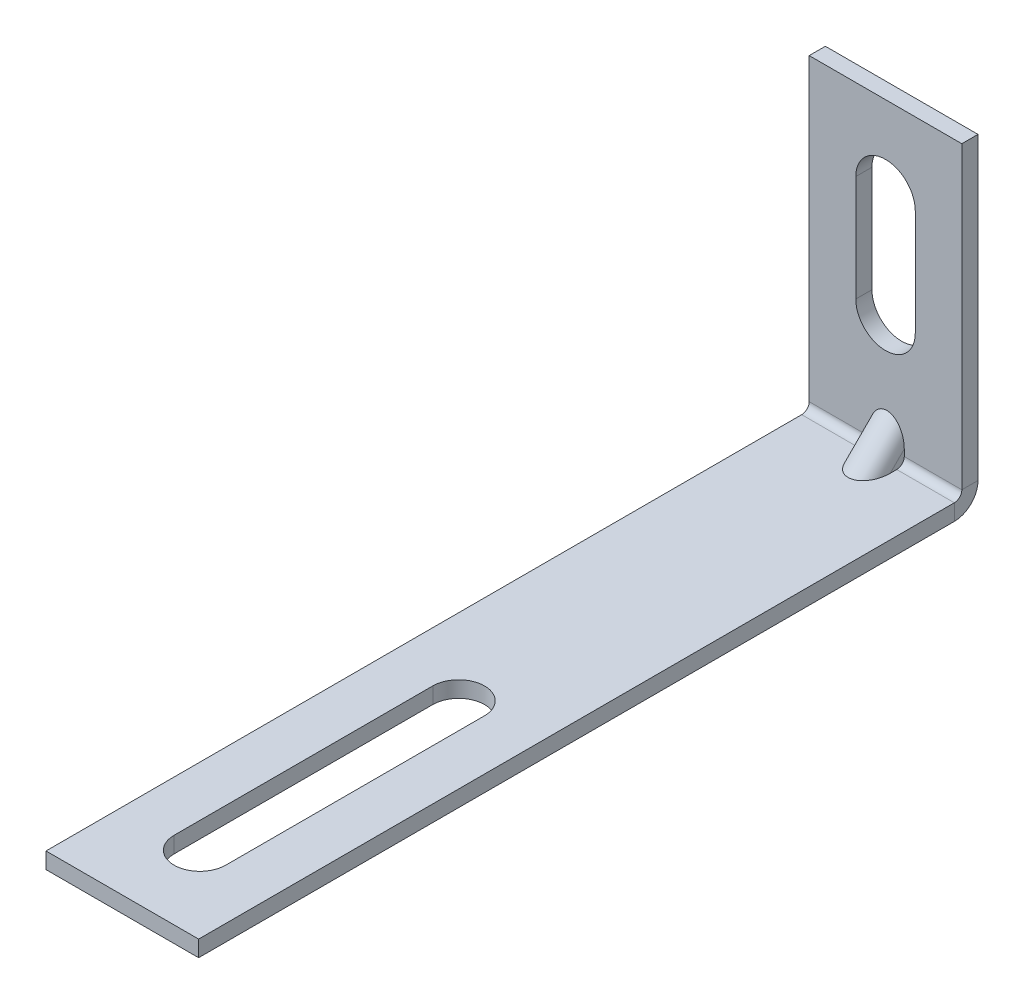
ISO-10303-21;
HEADER;
FILE_DESCRIPTION(('STEP AP214'),'2;1');
FILE_NAME('part.step','',(''),(''),'','','');
FILE_SCHEMA(('AUTOMOTIVE_DESIGN { 1 0 10303 214 1 1 1 1 }'));
ENDSEC;
DATA;
#1=APPLICATION_CONTEXT('core data for automotive mechanical design processes');
#2=APPLICATION_PROTOCOL_DEFINITION('international standard','automotive_design',2000,#1);
#3=PRODUCT_CONTEXT('',#1,'mechanical');
#4=PRODUCT('Part','Part','',(#3));
#5=PRODUCT_RELATED_PRODUCT_CATEGORY('part','',(#4));
#6=PRODUCT_DEFINITION_FORMATION('','',#4);
#7=PRODUCT_DEFINITION_CONTEXT('part definition',#1,'design');
#8=PRODUCT_DEFINITION('design','',#6,#7);
#9=PRODUCT_DEFINITION_SHAPE('','',#8);
#10=(LENGTH_UNIT() NAMED_UNIT(*) SI_UNIT(.MILLI.,.METRE.));
#11=(NAMED_UNIT(*) PLANE_ANGLE_UNIT() SI_UNIT($,.RADIAN.));
#12=(NAMED_UNIT(*) SI_UNIT($,.STERADIAN.) SOLID_ANGLE_UNIT());
#13=UNCERTAINTY_MEASURE_WITH_UNIT(LENGTH_MEASURE(1.E-05),#10,'distance_accuracy_value','');
#14=(GEOMETRIC_REPRESENTATION_CONTEXT(3) GLOBAL_UNCERTAINTY_ASSIGNED_CONTEXT((#13)) GLOBAL_UNIT_ASSIGNED_CONTEXT((#10,
#11,#12)) REPRESENTATION_CONTEXT('',''));
#15=CARTESIAN_POINT('',(0.,0.,0.));
#16=DIRECTION('',(0.,0.,1.));
#17=DIRECTION('',(1.,0.,0.));
#18=AXIS2_PLACEMENT_3D('',#15,#16,#17);
#19=CARTESIAN_POINT('',(-7.493,2.32409999999999,2.3241));
#20=DIRECTION('',(-1.,0.,0.));
#21=DIRECTION('',(0.,0.,-1.));
#22=AXIS2_PLACEMENT_3D('',#19,#20,#21);
#23=CYLINDRICAL_SURFACE('',#22,2.3241);
#24=DIRECTION('',(-1.,0.,0.));
#25=VECTOR('',#24,1.);
#26=CARTESIAN_POINT('',(-7.493,0.,2.3241));
#27=LINE('',#26,#25);
#28=CARTESIAN_POINT('',(0.253999999999999,0.,2.3241));
#29=VERTEX_POINT('',#28);
#30=CARTESIAN_POINT('',(7.493,0.,2.3241));
#31=VERTEX_POINT('',#30);
#32=EDGE_CURVE('E355',#29,#31,#27,.F.);
#33=ORIENTED_EDGE('',*,*,#32,.F.);
#34=CARTESIAN_POINT('',(0.253999999999999,2.32409999999999,2.3241));
#35=DIRECTION('',(-1.,0.,0.));
#36=DIRECTION('',(0.,0.,1.));
#37=AXIS2_PLACEMENT_3D('',#34,#35,#36);
#38=CIRCLE('',#37,2.3241);
#39=CARTESIAN_POINT('',(0.253999999999999,2.32409999999998,0.));
#40=VERTEX_POINT('',#39);
#41=EDGE_CURVE('E256',#29,#40,#38,.F.);
#42=ORIENTED_EDGE('',*,*,#41,.T.);
#43=DIRECTION('',(-1.,0.,0.));
#44=VECTOR('',#43,1.);
#45=CARTESIAN_POINT('',(7.493,2.32410000000001,0.));
#46=LINE('',#45,#44);
#47=CARTESIAN_POINT('',(7.493,2.32409999999998,0.));
#48=VERTEX_POINT('',#47);
#49=EDGE_CURVE('E342',#40,#48,#46,.F.);
#50=ORIENTED_EDGE('',*,*,#49,.T.);
#51=CARTESIAN_POINT('',(7.493,2.32409999999999,2.3241));
#52=DIRECTION('',(-1.,0.,0.));
#53=DIRECTION('',(0.,0.,1.));
#54=AXIS2_PLACEMENT_3D('',#51,#52,#53);
#55=CIRCLE('',#54,2.3241);
#56=EDGE_CURVE('E354',#31,#48,#55,.F.);
#57=ORIENTED_EDGE('',*,*,#56,.F.);
#58=EDGE_LOOP('',(#33,#42,#50,#57));
#59=FACE_BOUND('',#58,.T.);
#60=ADVANCED_FACE('F61',(#59),#23,.T.);
#61=CARTESIAN_POINT('',(-7.493,2.32409999999999,2.3241));
#62=DIRECTION('',(-1.,0.,0.));
#63=DIRECTION('',(0.,0.,-1.));
#64=AXIS2_PLACEMENT_3D('',#61,#62,#63);
#65=CYLINDRICAL_SURFACE('',#64,0.736600000000001);
#66=CARTESIAN_POINT('',(1.8415,2.32409999999999,2.3241));
#67=DIRECTION('',(-1.,0.,0.));
#68=DIRECTION('',(0.,0.,1.));
#69=AXIS2_PLACEMENT_3D('',#66,#67,#68);
#70=CIRCLE('',#69,0.736600000000001);
#71=CARTESIAN_POINT('',(1.8415,1.58749999999999,2.3241));
#72=VERTEX_POINT('',#71);
#73=CARTESIAN_POINT('',(1.8415,2.3241,1.58749999999999));
#74=VERTEX_POINT('',#73);
#75=EDGE_CURVE('E275',#72,#74,#70,.F.);
#76=ORIENTED_EDGE('',*,*,#75,.F.);
#77=DIRECTION('',(-1.,0.,0.));
#78=VECTOR('',#77,1.);
#79=CARTESIAN_POINT('',(-7.493,1.58749999999999,2.3241));
#80=LINE('',#79,#78);
#81=CARTESIAN_POINT('',(7.493,1.5875,2.3241));
#82=VERTEX_POINT('',#81);
#83=EDGE_CURVE('E368',#72,#82,#80,.F.);
#84=ORIENTED_EDGE('',*,*,#83,.T.);
#85=CARTESIAN_POINT('',(7.493,2.32409999999999,2.3241));
#86=DIRECTION('',(-1.,0.,0.));
#87=DIRECTION('',(0.,0.,1.));
#88=AXIS2_PLACEMENT_3D('',#85,#86,#87);
#89=CIRCLE('',#88,0.736600000000001);
#90=CARTESIAN_POINT('',(7.493,2.32409999999999,1.58749999999999));
#91=VERTEX_POINT('',#90);
#92=EDGE_CURVE('E362',#82,#91,#89,.F.);
#93=ORIENTED_EDGE('',*,*,#92,.T.);
#94=DIRECTION('',(-1.,0.,0.));
#95=VECTOR('',#94,1.);
#96=CARTESIAN_POINT('',(7.493,2.3241,1.5875));
#97=LINE('',#96,#95);
#98=EDGE_CURVE('E346',#91,#74,#97,.T.);
#99=ORIENTED_EDGE('',*,*,#98,.T.);
#100=EDGE_LOOP('',(#76,#84,#93,#99));
#101=FACE_BOUND('',#100,.T.);
#102=ADVANCED_FACE('F436',(#101),#65,.F.);
#103=CARTESIAN_POINT('',(7.493,1.5875,0.));
#104=DIRECTION('',(-1.,0.,0.));
#105=DIRECTION('',(0.,0.,1.));
#106=AXIS2_PLACEMENT_3D('',#103,#104,#105);
#107=PLANE('',#106);
#108=DIRECTION('',(0.,-1.,0.));
#109=VECTOR('',#108,1.);
#110=CARTESIAN_POINT('',(7.493,1.58749999999999,2.3241));
#111=LINE('',#110,#109);
#112=EDGE_CURVE('E371',#82,#31,#111,.T.);
#113=ORIENTED_EDGE('',*,*,#112,.F.);
#114=DIRECTION('',(0.,0.,-1.));
#115=VECTOR('',#114,1.);
#116=CARTESIAN_POINT('',(7.493,1.5875,0.));
#117=LINE('',#116,#115);
#118=CARTESIAN_POINT('',(7.49300000000001,1.5875,76.5175));
#119=VERTEX_POINT('',#118);
#120=EDGE_CURVE('E376',#119,#82,#117,.T.);
#121=ORIENTED_EDGE('',*,*,#120,.F.);
#122=DIRECTION('',(0.,-1.,0.));
#123=VECTOR('',#122,1.);
#124=CARTESIAN_POINT('',(7.49300000000001,1.5875,76.5175));
#125=LINE('',#124,#123);
#126=CARTESIAN_POINT('',(7.49300000000001,0.,76.5175));
#127=VERTEX_POINT('',#126);
#128=EDGE_CURVE('E384',#119,#127,#125,.T.);
#129=ORIENTED_EDGE('',*,*,#128,.T.);
#130=DIRECTION('',(0.,0.,-1.));
#131=VECTOR('',#130,1.);
#132=CARTESIAN_POINT('',(7.493,0.,0.));
#133=LINE('',#132,#131);
#134=EDGE_CURVE('E374',#127,#31,#133,.T.);
#135=ORIENTED_EDGE('',*,*,#134,.T.);
#136=EDGE_LOOP('',(#113,#121,#129,#135));
#137=FACE_BOUND('',#136,.T.);
#138=ADVANCED_FACE('F63',(#137),#107,.F.);
#139=CARTESIAN_POINT('',(-7.493,1.5875,0.));
#140=DIRECTION('',(1.,0.,0.));
#141=DIRECTION('',(0.,0.,-1.));
#142=AXIS2_PLACEMENT_3D('',#139,#140,#141);
#143=PLANE('',#142);
#144=DIRECTION('',(0.,-1.,0.));
#145=VECTOR('',#144,1.);
#146=CARTESIAN_POINT('',(-7.493,1.58749999999999,2.3241));
#147=LINE('',#146,#145);
#148=CARTESIAN_POINT('',(-7.493,1.5875,2.3241));
#149=VERTEX_POINT('',#148);
#150=CARTESIAN_POINT('',(-7.493,0.,2.3241));
#151=VERTEX_POINT('',#150);
#152=EDGE_CURVE('E358',#149,#151,#147,.T.);
#153=ORIENTED_EDGE('',*,*,#152,.T.);
#154=DIRECTION('',(0.,0.,1.));
#155=VECTOR('',#154,1.);
#156=CARTESIAN_POINT('',(-7.493,0.,0.));
#157=LINE('',#156,#155);
#158=CARTESIAN_POINT('',(-7.49300000000001,0.,76.5175));
#159=VERTEX_POINT('',#158);
#160=EDGE_CURVE('E387',#151,#159,#157,.T.);
#161=ORIENTED_EDGE('',*,*,#160,.T.);
#162=DIRECTION('',(0.,-1.,0.));
#163=VECTOR('',#162,1.);
#164=CARTESIAN_POINT('',(-7.49300000000001,1.5875,76.5175));
#165=LINE('',#164,#163);
#166=CARTESIAN_POINT('',(-7.49300000000001,1.5875,76.5175));
#167=VERTEX_POINT('',#166);
#168=EDGE_CURVE('E392',#167,#159,#165,.T.);
#169=ORIENTED_EDGE('',*,*,#168,.F.);
#170=DIRECTION('',(0.,0.,1.));
#171=VECTOR('',#170,1.);
#172=CARTESIAN_POINT('',(-7.493,1.5875,0.));
#173=LINE('',#172,#171);
#174=EDGE_CURVE('E379',#149,#167,#173,.T.);
#175=ORIENTED_EDGE('',*,*,#174,.F.);
#176=EDGE_LOOP('',(#153,#161,#169,#175));
#177=FACE_BOUND('',#176,.T.);
#178=ADVANCED_FACE('F469',(#177),#143,.F.);
#179=CARTESIAN_POINT('',(0.,1.5875,0.));
#180=DIRECTION('',(0.,1.,0.));
#181=DIRECTION('',(0.,0.,1.));
#182=AXIS2_PLACEMENT_3D('',#179,#180,#181);
#183=PLANE('',#182);
#184=CARTESIAN_POINT('',(0.,1.5875,68.8975));
#185=DIRECTION('',(0.,1.,0.));
#186=DIRECTION('',(0.,0.,1.));
#187=AXIS2_PLACEMENT_3D('',#184,#185,#186);
#188=CIRCLE('',#187,2.54);
#189=CARTESIAN_POINT('',(-2.54000000000001,1.5875,68.8975));
#190=VERTEX_POINT('',#189);
#191=CARTESIAN_POINT('',(2.53999999999999,1.5875,68.8975));
#192=VERTEX_POINT('',#191);
#193=EDGE_CURVE('E76',#190,#192,#188,.T.);
#194=ORIENTED_EDGE('',*,*,#193,.F.);
#195=DIRECTION('',(0.,0.,1.));
#196=VECTOR('',#195,1.);
#197=CARTESIAN_POINT('',(-2.54000000000001,1.5875,68.8975));
#198=LINE('',#197,#196);
#199=CARTESIAN_POINT('',(-2.54,1.5875,43.4975));
#200=VERTEX_POINT('',#199);
#201=EDGE_CURVE('E241',#200,#190,#198,.T.);
#202=ORIENTED_EDGE('',*,*,#201,.F.);
#203=CARTESIAN_POINT('',(0.,1.5875,43.4975));
#204=DIRECTION('',(0.,1.,0.));
#205=DIRECTION('',(0.,0.,1.));
#206=AXIS2_PLACEMENT_3D('',#203,#204,#205);
#207=CIRCLE('',#206,2.54);
#208=CARTESIAN_POINT('',(2.54,1.5875,43.4975));
#209=VERTEX_POINT('',#208);
#210=EDGE_CURVE('E225',#209,#200,#207,.T.);
#211=ORIENTED_EDGE('',*,*,#210,.F.);
#212=DIRECTION('',(0.,0.,-1.));
#213=VECTOR('',#212,1.);
#214=CARTESIAN_POINT('',(2.53999999999999,1.5875,68.8975));
#215=LINE('',#214,#213);
#216=EDGE_CURVE('E234',#192,#209,#215,.T.);
#217=ORIENTED_EDGE('',*,*,#216,.F.);
#218=EDGE_LOOP('',(#194,#202,#211,#217));
#219=FACE_BOUND('',#218,.T.);
#220=DIRECTION('',(0.,0.,1.));
#221=VECTOR('',#220,1.);
#222=CARTESIAN_POINT('',(-1.5875,1.5875,0.));
#223=LINE('',#222,#221);
#224=CARTESIAN_POINT('',(-1.5875,1.58749999999999,2.3241));
#225=VERTEX_POINT('',#224);
#226=CARTESIAN_POINT('',(-1.5875,1.5875,2.96191718266822));
#227=VERTEX_POINT('',#226);
#228=EDGE_CURVE('E285',#225,#227,#223,.T.);
#229=ORIENTED_EDGE('',*,*,#228,.F.);
#230=EDGE_CURVE('E365',#149,#225,#80,.F.);
#231=ORIENTED_EDGE('',*,*,#230,.F.);
#232=ORIENTED_EDGE('',*,*,#174,.T.);
#233=DIRECTION('',(1.,0.,0.));
#234=VECTOR('',#233,1.);
#235=CARTESIAN_POINT('',(-7.49300000000001,1.5875,76.5175));
#236=LINE('',#235,#234);
#237=EDGE_CURVE('E382',#167,#119,#236,.T.);
#238=ORIENTED_EDGE('',*,*,#237,.T.);
#239=ORIENTED_EDGE('',*,*,#120,.T.);
#240=ORIENTED_EDGE('',*,*,#83,.F.);
#241=DIRECTION('',(0.,0.,1.));
#242=VECTOR('',#241,1.);
#243=CARTESIAN_POINT('',(1.8415,1.5875,0.));
#244=LINE('',#243,#242);
#245=CARTESIAN_POINT('',(1.8415,1.5875,2.96191718266822));
#246=VERTEX_POINT('',#245);
#247=EDGE_CURVE('E278',#72,#246,#244,.T.);
#248=ORIENTED_EDGE('',*,*,#247,.T.);
#249=CARTESIAN_POINT('',(0.126999999999999,1.5875,2.96191718266822));
#250=DIRECTION('',(0.,1.,0.));
#251=DIRECTION('',(0.,0.,1.));
#252=AXIS2_PLACEMENT_3D('',#249,#250,#251);
#253=ELLIPSE('',#252,2.42466915268866,1.7145);
#254=EDGE_CURVE('E291',#227,#246,#253,.T.);
#255=ORIENTED_EDGE('',*,*,#254,.F.);
#256=EDGE_LOOP('',(#229,#231,#232,#238,#239,#240,#248,#255));
#257=FACE_BOUND('',#256,.T.);
#258=ADVANCED_FACE('F238',(#219,#257),#183,.T.);
#259=CARTESIAN_POINT('',(0.,0.,0.));
#260=DIRECTION('',(0.,1.,0.));
#261=DIRECTION('',(0.,0.,1.));
#262=AXIS2_PLACEMENT_3D('',#259,#260,#261);
#263=PLANE('',#262);
#264=DIRECTION('',(0.,0.,1.));
#265=VECTOR('',#264,1.);
#266=CARTESIAN_POINT('',(-2.53999999999999,0.,0.));
#267=LINE('',#266,#265);
#268=CARTESIAN_POINT('',(-2.54,0.,43.4975));
#269=VERTEX_POINT('',#268);
#270=CARTESIAN_POINT('',(-2.54000000000001,0.,68.8975));
#271=VERTEX_POINT('',#270);
#272=EDGE_CURVE('E69',#269,#271,#267,.T.);
#273=ORIENTED_EDGE('',*,*,#272,.T.);
#274=CARTESIAN_POINT('',(0.,0.,68.8975));
#275=DIRECTION('',(0.,1.,0.));
#276=DIRECTION('',(0.,0.,1.));
#277=AXIS2_PLACEMENT_3D('',#274,#275,#276);
#278=CIRCLE('',#277,2.54);
#279=CARTESIAN_POINT('',(2.53999999999999,0.,68.8975));
#280=VERTEX_POINT('',#279);
#281=EDGE_CURVE('E14',#271,#280,#278,.T.);
#282=ORIENTED_EDGE('',*,*,#281,.T.);
#283=DIRECTION('',(0.,0.,-1.));
#284=VECTOR('',#283,1.);
#285=CARTESIAN_POINT('',(2.54000000000002,0.,0.));
#286=LINE('',#285,#284);
#287=CARTESIAN_POINT('',(2.54,0.,43.4975));
#288=VERTEX_POINT('',#287);
#289=EDGE_CURVE('E412',#280,#288,#286,.T.);
#290=ORIENTED_EDGE('',*,*,#289,.T.);
#291=CARTESIAN_POINT('',(0.,0.,43.4975));
#292=DIRECTION('',(0.,1.,0.));
#293=DIRECTION('',(0.,0.,1.));
#294=AXIS2_PLACEMENT_3D('',#291,#292,#293);
#295=CIRCLE('',#294,2.54);
#296=EDGE_CURVE('E228',#288,#269,#295,.T.);
#297=ORIENTED_EDGE('',*,*,#296,.T.);
#298=EDGE_LOOP('',(#273,#282,#290,#297));
#299=FACE_BOUND('',#298,.T.);
#300=CARTESIAN_POINT('',(0.,0.,2.3241));
#301=VERTEX_POINT('',#300);
#302=EDGE_CURVE('E351',#151,#301,#27,.F.);
#303=ORIENTED_EDGE('',*,*,#302,.T.);
#304=DIRECTION('',(0.,0.,1.));
#305=VECTOR('',#304,1.);
#306=CARTESIAN_POINT('',(0.,0.,0.));
#307=LINE('',#306,#305);
#308=CARTESIAN_POINT('',(0.,0.,4.54941718266821));
#309=VERTEX_POINT('',#308);
#310=EDGE_CURVE('E263',#301,#309,#307,.T.);
#311=ORIENTED_EDGE('',*,*,#310,.T.);
#312=CARTESIAN_POINT('',(0.126999999999999,0.,4.54941718266821));
#313=DIRECTION('',(0.,1.,0.));
#314=DIRECTION('',(0.,0.,1.));
#315=AXIS2_PLACEMENT_3D('',#312,#313,#314);
#316=ELLIPSE('',#315,0.179605122421383,0.127);
#317=CARTESIAN_POINT('',(0.253999999999999,0.,4.54941718266821));
#318=VERTEX_POINT('',#317);
#319=EDGE_CURVE('E266',#309,#318,#316,.T.);
#320=ORIENTED_EDGE('',*,*,#319,.T.);
#321=DIRECTION('',(0.,0.,1.));
#322=VECTOR('',#321,1.);
#323=CARTESIAN_POINT('',(0.253999999999999,0.,0.));
#324=LINE('',#323,#322);
#325=EDGE_CURVE('E259',#29,#318,#324,.T.);
#326=ORIENTED_EDGE('',*,*,#325,.F.);
#327=ORIENTED_EDGE('',*,*,#32,.T.);
#328=ORIENTED_EDGE('',*,*,#134,.F.);
#329=DIRECTION('',(1.,0.,0.));
#330=VECTOR('',#329,1.);
#331=CARTESIAN_POINT('',(-7.49300000000001,0.,76.5175));
#332=LINE('',#331,#330);
#333=EDGE_CURVE('E380',#159,#127,#332,.T.);
#334=ORIENTED_EDGE('',*,*,#333,.F.);
#335=ORIENTED_EDGE('',*,*,#160,.F.);
#336=EDGE_LOOP('',(#303,#311,#320,#326,#327,#328,#334,#335));
#337=FACE_BOUND('',#336,.T.);
#338=ADVANCED_FACE('F416',(#299,#337),#263,.F.);
#339=CARTESIAN_POINT('',(-7.49300000000001,1.5875,76.5175));
#340=DIRECTION('',(0.,0.,-1.));
#341=DIRECTION('',(-1.,0.,0.));
#342=AXIS2_PLACEMENT_3D('',#339,#340,#341);
#343=PLANE('',#342);
#344=ORIENTED_EDGE('',*,*,#333,.T.);
#345=ORIENTED_EDGE('',*,*,#128,.F.);
#346=ORIENTED_EDGE('',*,*,#237,.F.);
#347=ORIENTED_EDGE('',*,*,#168,.T.);
#348=EDGE_LOOP('',(#344,#345,#346,#347));
#349=FACE_BOUND('',#348,.T.);
#350=ADVANCED_FACE('F474',(#349),#343,.F.);
#351=CARTESIAN_POINT('',(7.493,2.32409999999999,2.3241));
#352=DIRECTION('',(1.,0.,0.));
#353=DIRECTION('',(0.,0.,-1.));
#354=AXIS2_PLACEMENT_3D('',#351,#352,#353);
#355=PLANE('',#354);
#356=DIRECTION('',(0.,0.,1.));
#357=VECTOR('',#356,1.);
#358=CARTESIAN_POINT('',(7.493,2.32410000000001,0.));
#359=LINE('',#358,#357);
#360=EDGE_CURVE('E311',#91,#48,#359,.F.);
#361=ORIENTED_EDGE('',*,*,#360,.F.);
#362=ORIENTED_EDGE('',*,*,#92,.F.);
#363=ORIENTED_EDGE('',*,*,#112,.T.);
#364=ORIENTED_EDGE('',*,*,#56,.T.);
#365=EDGE_LOOP('',(#361,#362,#363,#364));
#366=FACE_BOUND('',#365,.T.);
#367=ADVANCED_FACE('F457',(#366),#355,.T.);
#368=CARTESIAN_POINT('',(-7.493,2.32409999999999,2.3241));
#369=DIRECTION('',(1.,0.,0.));
#370=DIRECTION('',(0.,0.,-1.));
#371=AXIS2_PLACEMENT_3D('',#368,#369,#370);
#372=PLANE('',#371);
#373=CARTESIAN_POINT('',(-7.493,2.32409999999999,2.3241));
#374=DIRECTION('',(-1.,0.,0.));
#375=DIRECTION('',(0.,0.,1.));
#376=AXIS2_PLACEMENT_3D('',#373,#374,#375);
#377=CIRCLE('',#376,0.736600000000001);
#378=CARTESIAN_POINT('',(-7.493,2.32409999999999,1.58749999999999));
#379=VERTEX_POINT('',#378);
#380=EDGE_CURVE('E321',#379,#149,#377,.T.);
#381=ORIENTED_EDGE('',*,*,#380,.F.);
#382=DIRECTION('',(0.,0.,1.));
#383=VECTOR('',#382,1.);
#384=CARTESIAN_POINT('',(-7.493,2.3241,1.5875));
#385=LINE('',#384,#383);
#386=CARTESIAN_POINT('',(-7.493,2.32410000000001,0.));
#387=VERTEX_POINT('',#386);
#388=EDGE_CURVE('E343',#379,#387,#385,.F.);
#389=ORIENTED_EDGE('',*,*,#388,.T.);
#390=CARTESIAN_POINT('',(-7.493,2.32409999999999,2.3241));
#391=DIRECTION('',(-1.,0.,0.));
#392=DIRECTION('',(0.,0.,1.));
#393=AXIS2_PLACEMENT_3D('',#390,#391,#392);
#394=CIRCLE('',#393,2.3241);
#395=EDGE_CURVE('E359',#387,#151,#394,.T.);
#396=ORIENTED_EDGE('',*,*,#395,.T.);
#397=ORIENTED_EDGE('',*,*,#152,.F.);
#398=EDGE_LOOP('',(#381,#389,#396,#397));
#399=FACE_BOUND('',#398,.T.);
#400=ADVANCED_FACE('F449',(#399),#372,.F.);
#401=CARTESIAN_POINT('',(0.,2.32409999999999,2.3241));
#402=DIRECTION('',(-1.,0.,0.));
#403=DIRECTION('',(0.,0.,1.));
#404=AXIS2_PLACEMENT_3D('',#401,#402,#403);
#405=CIRCLE('',#404,2.3241);
#406=CARTESIAN_POINT('',(0.,2.32409999999998,0.));
#407=VERTEX_POINT('',#406);
#408=EDGE_CURVE('E261',#301,#407,#405,.F.);
#409=ORIENTED_EDGE('',*,*,#408,.F.);
#410=ORIENTED_EDGE('',*,*,#302,.F.);
#411=ORIENTED_EDGE('',*,*,#395,.F.);
#412=EDGE_CURVE('E339',#387,#407,#46,.F.);
#413=ORIENTED_EDGE('',*,*,#412,.T.);
#414=EDGE_LOOP('',(#409,#410,#411,#413));
#415=FACE_BOUND('',#414,.T.);
#416=ADVANCED_FACE('F439',(#415),#23,.T.);
#417=ORIENTED_EDGE('',*,*,#230,.T.);
#418=CARTESIAN_POINT('',(-1.5875,2.32409999999999,2.3241));
#419=DIRECTION('',(-1.,0.,0.));
#420=DIRECTION('',(0.,0.,1.));
#421=AXIS2_PLACEMENT_3D('',#418,#419,#420);
#422=CIRCLE('',#421,0.736600000000001);
#423=CARTESIAN_POINT('',(-1.5875,2.3241,1.5875));
#424=VERTEX_POINT('',#423);
#425=EDGE_CURVE('E283',#225,#424,#422,.F.);
#426=ORIENTED_EDGE('',*,*,#425,.T.);
#427=EDGE_CURVE('E348',#424,#379,#97,.T.);
#428=ORIENTED_EDGE('',*,*,#427,.T.);
#429=ORIENTED_EDGE('',*,*,#380,.T.);
#430=EDGE_LOOP('',(#417,#426,#428,#429));
#431=FACE_BOUND('',#430,.T.);
#432=ADVANCED_FACE('F445',(#431),#65,.F.);
#433=CARTESIAN_POINT('',(7.493,1.58749999999999,0.));
#434=DIRECTION('',(-1.,0.,0.));
#435=DIRECTION('',(0.,0.,1.));
#436=AXIS2_PLACEMENT_3D('',#433,#434,#435);
#437=PLANE('',#436);
#438=ORIENTED_EDGE('',*,*,#360,.T.);
#439=DIRECTION('',(0.,-1.,0.));
#440=VECTOR('',#439,1.);
#441=CARTESIAN_POINT('',(7.493,0.,0.));
#442=LINE('',#441,#440);
#443=CARTESIAN_POINT('',(7.493,31.75,-1.07812790568779E-13));
#444=VERTEX_POINT('',#443);
#445=EDGE_CURVE('E329',#444,#48,#442,.T.);
#446=ORIENTED_EDGE('',*,*,#445,.F.);
#447=DIRECTION('',(0.,0.,1.));
#448=VECTOR('',#447,1.);
#449=CARTESIAN_POINT('',(7.493,31.75,-1.07913891096821E-13));
#450=LINE('',#449,#448);
#451=CARTESIAN_POINT('',(7.493,31.75,1.58749999999989));
#452=VERTEX_POINT('',#451);
#453=EDGE_CURVE('E322',#444,#452,#450,.T.);
#454=ORIENTED_EDGE('',*,*,#453,.T.);
#455=DIRECTION('',(0.,1.,0.));
#456=VECTOR('',#455,1.);
#457=CARTESIAN_POINT('',(7.493,1.5875,1.5875));
#458=LINE('',#457,#456);
#459=EDGE_CURVE('E336',#452,#91,#458,.F.);
#460=ORIENTED_EDGE('',*,*,#459,.T.);
#461=EDGE_LOOP('',(#438,#446,#454,#460));
#462=FACE_BOUND('',#461,.T.);
#463=ADVANCED_FACE('F455',(#462),#437,.F.);
#464=CARTESIAN_POINT('',(-7.493,31.75,-1.05384451165591E-13));
#465=DIRECTION('',(1.,0.,0.));
#466=DIRECTION('',(0.,0.,-1.));
#467=AXIS2_PLACEMENT_3D('',#464,#465,#466);
#468=PLANE('',#467);
#469=ORIENTED_EDGE('',*,*,#388,.F.);
#470=DIRECTION('',(0.,-1.,0.));
#471=VECTOR('',#470,1.);
#472=CARTESIAN_POINT('',(-7.493,31.75,1.58749999999989));
#473=LINE('',#472,#471);
#474=CARTESIAN_POINT('',(-7.493,31.75,1.58749999999989));
#475=VERTEX_POINT('',#474);
#476=EDGE_CURVE('E334',#379,#475,#473,.F.);
#477=ORIENTED_EDGE('',*,*,#476,.T.);
#478=DIRECTION('',(0.,0.,1.));
#479=VECTOR('',#478,1.);
#480=CARTESIAN_POINT('',(-7.493,31.75,-1.05396402878654E-13));
#481=LINE('',#480,#479);
#482=CARTESIAN_POINT('',(-7.493,31.75,-1.05222657067876E-13));
#483=VERTEX_POINT('',#482);
#484=EDGE_CURVE('E318',#483,#475,#481,.T.);
#485=ORIENTED_EDGE('',*,*,#484,.F.);
#486=DIRECTION('',(0.,1.,0.));
#487=VECTOR('',#486,1.);
#488=CARTESIAN_POINT('',(-7.493,0.,0.));
#489=LINE('',#488,#487);
#490=EDGE_CURVE('E327',#387,#483,#489,.T.);
#491=ORIENTED_EDGE('',*,*,#490,.F.);
#492=EDGE_LOOP('',(#469,#477,#485,#491));
#493=FACE_BOUND('',#492,.T.);
#494=ADVANCED_FACE('F510',(#493),#468,.F.);
#495=CARTESIAN_POINT('',(0.,0.,0.));
#496=DIRECTION('',(0.,0.,1.));
#497=DIRECTION('',(0.,-1.,0.));
#498=AXIS2_PLACEMENT_3D('',#495,#496,#497);
#499=PLANE('',#498);
#500=CARTESIAN_POINT('',(0.126999999999999,4.54941718266825,0.));
#501=DIRECTION('',(0.,0.,1.));
#502=DIRECTION('',(0.,-1.,0.));
#503=AXIS2_PLACEMENT_3D('',#500,#501,#502);
#504=ELLIPSE('',#503,0.179605122421384,0.127);
#505=CARTESIAN_POINT('',(0.253999999999999,4.54941718266825,0.));
#506=VERTEX_POINT('',#505);
#507=CARTESIAN_POINT('',(0.,4.54941718266825,0.));
#508=VERTEX_POINT('',#507);
#509=EDGE_CURVE('E406',#506,#508,#504,.T.);
#510=ORIENTED_EDGE('',*,*,#509,.T.);
#511=DIRECTION('',(0.,-1.,0.));
#512=VECTOR('',#511,1.);
#513=CARTESIAN_POINT('',(0.,0.,0.));
#514=LINE('',#513,#512);
#515=EDGE_CURVE('E409',#508,#407,#514,.T.);
#516=ORIENTED_EDGE('',*,*,#515,.T.);
#517=ORIENTED_EDGE('',*,*,#412,.F.);
#518=ORIENTED_EDGE('',*,*,#490,.T.);
#519=DIRECTION('',(1.,0.,0.));
#520=VECTOR('',#519,1.);
#521=CARTESIAN_POINT('',(0.,31.75,-1.06517723818327E-13));
#522=LINE('',#521,#520);
#523=EDGE_CURVE('E325',#483,#444,#522,.T.);
#524=ORIENTED_EDGE('',*,*,#523,.T.);
#525=ORIENTED_EDGE('',*,*,#445,.T.);
#526=ORIENTED_EDGE('',*,*,#49,.F.);
#527=DIRECTION('',(0.,-1.,0.));
#528=VECTOR('',#527,1.);
#529=CARTESIAN_POINT('',(0.253999999999999,0.,0.));
#530=LINE('',#529,#528);
#531=EDGE_CURVE('E404',#506,#40,#530,.T.);
#532=ORIENTED_EDGE('',*,*,#531,.F.);
#533=EDGE_LOOP('',(#510,#516,#517,#518,#524,#525,#526,#532));
#534=FACE_BOUND('',#533,.T.);
#535=DIRECTION('',(0.,-1.,0.));
#536=VECTOR('',#535,1.);
#537=CARTESIAN_POINT('',(2.921,23.749,0.));
#538=LINE('',#537,#536);
#539=CARTESIAN_POINT('',(2.921,23.749,0.));
#540=VERTEX_POINT('',#539);
#541=CARTESIAN_POINT('',(2.921,13.335,0.));
#542=VERTEX_POINT('',#541);
#543=EDGE_CURVE('E299',#540,#542,#538,.T.);
#544=ORIENTED_EDGE('',*,*,#543,.F.);
#545=CARTESIAN_POINT('',(0.,23.749,0.));
#546=DIRECTION('',(0.,0.,-1.));
#547=DIRECTION('',(0.,1.,0.));
#548=AXIS2_PLACEMENT_3D('',#545,#546,#547);
#549=CIRCLE('',#548,2.921);
#550=CARTESIAN_POINT('',(-2.921,23.749,0.));
#551=VERTEX_POINT('',#550);
#552=EDGE_CURVE('E297',#551,#540,#549,.T.);
#553=ORIENTED_EDGE('',*,*,#552,.F.);
#554=DIRECTION('',(0.,1.,0.));
#555=VECTOR('',#554,1.);
#556=CARTESIAN_POINT('',(-2.921,23.749,0.));
#557=LINE('',#556,#555);
#558=CARTESIAN_POINT('',(-2.921,13.335,0.));
#559=VERTEX_POINT('',#558);
#560=EDGE_CURVE('E305',#559,#551,#557,.T.);
#561=ORIENTED_EDGE('',*,*,#560,.F.);
#562=CARTESIAN_POINT('',(0.,13.335,0.));
#563=DIRECTION('',(0.,0.,-1.));
#564=DIRECTION('',(0.,1.,0.));
#565=AXIS2_PLACEMENT_3D('',#562,#563,#564);
#566=CIRCLE('',#565,2.921);
#567=EDGE_CURVE('E302',#542,#559,#566,.T.);
#568=ORIENTED_EDGE('',*,*,#567,.F.);
#569=EDGE_LOOP('',(#544,#553,#561,#568));
#570=FACE_BOUND('',#569,.T.);
#571=ADVANCED_FACE('F512',(#534,#570),#499,.F.);
#572=CARTESIAN_POINT('',(0.,0.,1.5875));
#573=DIRECTION('',(0.,0.,1.));
#574=DIRECTION('',(0.,-1.,0.));
#575=AXIS2_PLACEMENT_3D('',#572,#573,#574);
#576=PLANE('',#575);
#577=DIRECTION('',(0.,-1.,0.));
#578=VECTOR('',#577,1.);
#579=CARTESIAN_POINT('',(-1.5875,0.,1.5875));
#580=LINE('',#579,#578);
#581=CARTESIAN_POINT('',(-1.5875,2.96191718266824,1.58749999999999));
#582=VERTEX_POINT('',#581);
#583=EDGE_CURVE('E288',#582,#424,#580,.T.);
#584=ORIENTED_EDGE('',*,*,#583,.F.);
#585=CARTESIAN_POINT('',(0.126999999999999,2.96191718266824,1.58749999999999));
#586=DIRECTION('',(0.,0.,1.));
#587=DIRECTION('',(0.,-1.,0.));
#588=AXIS2_PLACEMENT_3D('',#585,#586,#587);
#589=ELLIPSE('',#588,2.42466915268869,1.7145);
#590=CARTESIAN_POINT('',(1.8415,2.96191718266824,1.58749999999999));
#591=VERTEX_POINT('',#590);
#592=EDGE_CURVE('E294',#591,#582,#589,.T.);
#593=ORIENTED_EDGE('',*,*,#592,.F.);
#594=DIRECTION('',(0.,-1.,0.));
#595=VECTOR('',#594,1.);
#596=CARTESIAN_POINT('',(1.8415,0.,1.5875));
#597=LINE('',#596,#595);
#598=EDGE_CURVE('E280',#591,#74,#597,.T.);
#599=ORIENTED_EDGE('',*,*,#598,.T.);
#600=ORIENTED_EDGE('',*,*,#98,.F.);
#601=ORIENTED_EDGE('',*,*,#459,.F.);
#602=DIRECTION('',(-1.,0.,0.));
#603=VECTOR('',#602,1.);
#604=CARTESIAN_POINT('',(7.493,31.75,1.58749999999989));
#605=LINE('',#604,#603);
#606=EDGE_CURVE('E332',#475,#452,#605,.F.);
#607=ORIENTED_EDGE('',*,*,#606,.F.);
#608=ORIENTED_EDGE('',*,*,#476,.F.);
#609=ORIENTED_EDGE('',*,*,#427,.F.);
#610=EDGE_LOOP('',(#584,#593,#599,#600,#601,#607,#608,#609));
#611=FACE_BOUND('',#610,.T.);
#612=CARTESIAN_POINT('',(0.,23.749,1.58749999999992));
#613=DIRECTION('',(0.,0.,1.));
#614=DIRECTION('',(0.,-1.,0.));
#615=AXIS2_PLACEMENT_3D('',#612,#613,#614);
#616=CIRCLE('',#615,2.921);
#617=CARTESIAN_POINT('',(2.921,23.749,1.58749999999994));
#618=VERTEX_POINT('',#617);
#619=CARTESIAN_POINT('',(-2.921,23.749,1.58749999999994));
#620=VERTEX_POINT('',#619);
#621=EDGE_CURVE('E402',#618,#620,#616,.T.);
#622=ORIENTED_EDGE('',*,*,#621,.F.);
#623=DIRECTION('',(0.,1.,0.));
#624=VECTOR('',#623,1.);
#625=CARTESIAN_POINT('',(2.921,0.,1.5875));
#626=LINE('',#625,#624);
#627=CARTESIAN_POINT('',(2.921,13.335,1.58749999999996));
#628=VERTEX_POINT('',#627);
#629=EDGE_CURVE('E395',#628,#618,#626,.T.);
#630=ORIENTED_EDGE('',*,*,#629,.F.);
#631=CARTESIAN_POINT('',(0.,13.335,1.58749999999996));
#632=DIRECTION('',(0.,0.,1.));
#633=DIRECTION('',(0.,-1.,0.));
#634=AXIS2_PLACEMENT_3D('',#631,#632,#633);
#635=CIRCLE('',#634,2.921);
#636=CARTESIAN_POINT('',(-2.921,13.335,1.58749999999997));
#637=VERTEX_POINT('',#636);
#638=EDGE_CURVE('E397',#637,#628,#635,.T.);
#639=ORIENTED_EDGE('',*,*,#638,.F.);
#640=DIRECTION('',(0.,-1.,0.));
#641=VECTOR('',#640,1.);
#642=CARTESIAN_POINT('',(-2.92100000000001,0.,1.5875));
#643=LINE('',#642,#641);
#644=EDGE_CURVE('E400',#620,#637,#643,.T.);
#645=ORIENTED_EDGE('',*,*,#644,.F.);
#646=EDGE_LOOP('',(#622,#630,#639,#645));
#647=FACE_BOUND('',#646,.T.);
#648=ADVANCED_FACE('F485',(#611,#647),#576,.T.);
#649=CARTESIAN_POINT('',(7.493,31.75,-1.07986536379556E-13));
#650=DIRECTION('',(0.,-1.,0.));
#651=DIRECTION('',(0.,0.,-1.));
#652=AXIS2_PLACEMENT_3D('',#649,#650,#651);
#653=PLANE('',#652);
#654=ORIENTED_EDGE('',*,*,#606,.T.);
#655=ORIENTED_EDGE('',*,*,#453,.F.);
#656=ORIENTED_EDGE('',*,*,#523,.F.);
#657=ORIENTED_EDGE('',*,*,#484,.T.);
#658=EDGE_LOOP('',(#654,#655,#656,#657));
#659=FACE_BOUND('',#658,.T.);
#660=ADVANCED_FACE('F506',(#659),#653,.F.);
#661=CARTESIAN_POINT('',(0.,23.749,2.53999999999992));
#662=DIRECTION('',(0.,0.,-1.));
#663=DIRECTION('',(0.,1.,0.));
#664=AXIS2_PLACEMENT_3D('',#661,#662,#663);
#665=CYLINDRICAL_SURFACE('',#664,2.921);
#666=ORIENTED_EDGE('',*,*,#621,.T.);
#667=DIRECTION('',(0.,0.,-1.));
#668=VECTOR('',#667,1.);
#669=CARTESIAN_POINT('',(-2.921,23.749,2.53999999999992));
#670=LINE('',#669,#668);
#671=EDGE_CURVE('E309',#620,#551,#670,.T.);
#672=ORIENTED_EDGE('',*,*,#671,.T.);
#673=ORIENTED_EDGE('',*,*,#552,.T.);
#674=DIRECTION('',(0.,0.,-1.));
#675=VECTOR('',#674,1.);
#676=CARTESIAN_POINT('',(2.921,23.749,2.53999999999992));
#677=LINE('',#676,#675);
#678=EDGE_CURVE('E308',#618,#540,#677,.T.);
#679=ORIENTED_EDGE('',*,*,#678,.F.);
#680=EDGE_LOOP('',(#666,#672,#673,#679));
#681=FACE_BOUND('',#680,.T.);
#682=ADVANCED_FACE('F577',(#681),#665,.F.);
#683=CARTESIAN_POINT('',(-2.921,23.749,2.53999999999992));
#684=DIRECTION('',(-1.,0.,0.));
#685=DIRECTION('',(0.,-1.,0.));
#686=AXIS2_PLACEMENT_3D('',#683,#684,#685);
#687=PLANE('',#686);
#688=ORIENTED_EDGE('',*,*,#644,.T.);
#689=DIRECTION('',(0.,0.,-1.));
#690=VECTOR('',#689,1.);
#691=CARTESIAN_POINT('',(-2.921,13.335,2.53999999999995));
#692=LINE('',#691,#690);
#693=EDGE_CURVE('E312',#637,#559,#692,.T.);
#694=ORIENTED_EDGE('',*,*,#693,.T.);
#695=ORIENTED_EDGE('',*,*,#560,.T.);
#696=ORIENTED_EDGE('',*,*,#671,.F.);
#697=EDGE_LOOP('',(#688,#694,#695,#696));
#698=FACE_BOUND('',#697,.T.);
#699=ADVANCED_FACE('F589',(#698),#687,.F.);
#700=CARTESIAN_POINT('',(0.,13.335,2.53999999999995));
#701=DIRECTION('',(0.,0.,-1.));
#702=DIRECTION('',(0.,1.,0.));
#703=AXIS2_PLACEMENT_3D('',#700,#701,#702);
#704=CYLINDRICAL_SURFACE('',#703,2.921);
#705=ORIENTED_EDGE('',*,*,#638,.T.);
#706=DIRECTION('',(0.,0.,-1.));
#707=VECTOR('',#706,1.);
#708=CARTESIAN_POINT('',(2.921,13.335,2.53999999999995));
#709=LINE('',#708,#707);
#710=EDGE_CURVE('E314',#628,#542,#709,.T.);
#711=ORIENTED_EDGE('',*,*,#710,.T.);
#712=ORIENTED_EDGE('',*,*,#567,.T.);
#713=ORIENTED_EDGE('',*,*,#693,.F.);
#714=EDGE_LOOP('',(#705,#711,#712,#713));
#715=FACE_BOUND('',#714,.T.);
#716=ADVANCED_FACE('F600',(#715),#704,.F.);
#717=CARTESIAN_POINT('',(2.921,23.749,2.53999999999992));
#718=DIRECTION('',(1.,0.,0.));
#719=DIRECTION('',(0.,0.,-1.));
#720=AXIS2_PLACEMENT_3D('',#717,#718,#719);
#721=PLANE('',#720);
#722=ORIENTED_EDGE('',*,*,#629,.T.);
#723=ORIENTED_EDGE('',*,*,#678,.T.);
#724=ORIENTED_EDGE('',*,*,#543,.T.);
#725=ORIENTED_EDGE('',*,*,#710,.F.);
#726=EDGE_LOOP('',(#722,#723,#724,#725));
#727=FACE_BOUND('',#726,.T.);
#728=ADVANCED_FACE('F611',(#727),#721,.F.);
#729=CARTESIAN_POINT('',(0.126999999999999,-1.905,6.45441718266821));
#730=DIRECTION('',(0.,-0.70710678118655,0.707106781186546));
#731=DIRECTION('',(0.,-0.707106781186546,-0.70710678118655));
#732=AXIS2_PLACEMENT_3D('',#729,#730,#731);
#733=CYLINDRICAL_SURFACE('',#732,1.7145);
#734=DIRECTION('',(0.,0.70710678118655,-0.707106781186546));
#735=VECTOR('',#734,1.);
#736=CARTESIAN_POINT('',(1.8415,-1.905,6.45441718266821));
#737=LINE('',#736,#735);
#738=EDGE_CURVE('E272',#591,#246,#737,.F.);
#739=ORIENTED_EDGE('',*,*,#738,.F.);
#740=ORIENTED_EDGE('',*,*,#592,.T.);
#741=DIRECTION('',(0.,-0.70710678118655,0.707106781186546));
#742=VECTOR('',#741,1.);
#743=CARTESIAN_POINT('',(-1.5875,2.27470859133411,2.27470859133412));
#744=LINE('',#743,#742);
#745=EDGE_CURVE('E269',#227,#582,#744,.F.);
#746=ORIENTED_EDGE('',*,*,#745,.F.);
#747=ORIENTED_EDGE('',*,*,#254,.T.);
#748=EDGE_LOOP('',(#739,#740,#746,#747));
#749=FACE_BOUND('',#748,.T.);
#750=ADVANCED_FACE('F493',(#749),#733,.T.);
#751=CARTESIAN_POINT('',(-1.5875,0.,0.));
#752=DIRECTION('',(-1.,0.,0.));
#753=DIRECTION('',(0.,0.,1.));
#754=AXIS2_PLACEMENT_3D('',#751,#752,#753);
#755=PLANE('',#754);
#756=ORIENTED_EDGE('',*,*,#745,.T.);
#757=ORIENTED_EDGE('',*,*,#583,.T.);
#758=ORIENTED_EDGE('',*,*,#425,.F.);
#759=ORIENTED_EDGE('',*,*,#228,.T.);
#760=EDGE_LOOP('',(#756,#757,#758,#759));
#761=FACE_BOUND('',#760,.T.);
#762=ADVANCED_FACE('F489',(#761),#755,.T.);
#763=CARTESIAN_POINT('',(1.8415,0.,0.));
#764=DIRECTION('',(-1.,0.,0.));
#765=DIRECTION('',(0.,0.,1.));
#766=AXIS2_PLACEMENT_3D('',#763,#764,#765);
#767=PLANE('',#766);
#768=ORIENTED_EDGE('',*,*,#598,.F.);
#769=ORIENTED_EDGE('',*,*,#738,.T.);
#770=ORIENTED_EDGE('',*,*,#247,.F.);
#771=ORIENTED_EDGE('',*,*,#75,.T.);
#772=EDGE_LOOP('',(#768,#769,#770,#771));
#773=FACE_BOUND('',#772,.T.);
#774=ADVANCED_FACE('F497',(#773),#767,.F.);
#775=CARTESIAN_POINT('',(0.126999999999999,-1.905,6.45441718266821));
#776=DIRECTION('',(0.,-0.70710678118655,0.707106781186546));
#777=DIRECTION('',(0.,-0.707106781186546,-0.70710678118655));
#778=AXIS2_PLACEMENT_3D('',#775,#776,#777);
#779=CYLINDRICAL_SURFACE('',#778,0.127);
#780=DIRECTION('',(0.,-0.70710678118655,0.707106781186546));
#781=VECTOR('',#780,1.);
#782=CARTESIAN_POINT('',(0.,-1.905,6.45441718266821));
#783=LINE('',#782,#781);
#784=EDGE_CURVE('E248',#309,#508,#783,.F.);
#785=ORIENTED_EDGE('',*,*,#784,.T.);
#786=ORIENTED_EDGE('',*,*,#509,.F.);
#787=DIRECTION('',(0.,-0.70710678118655,0.707106781186546));
#788=VECTOR('',#787,1.);
#789=CARTESIAN_POINT('',(0.253999999999999,-1.905,6.45441718266821));
#790=LINE('',#789,#788);
#791=EDGE_CURVE('E253',#506,#318,#790,.T.);
#792=ORIENTED_EDGE('',*,*,#791,.T.);
#793=ORIENTED_EDGE('',*,*,#319,.F.);
#794=EDGE_LOOP('',(#785,#786,#792,#793));
#795=FACE_BOUND('',#794,.T.);
#796=ADVANCED_FACE('F518',(#795),#779,.F.);
#797=CARTESIAN_POINT('',(0.,0.,0.));
#798=DIRECTION('',(-1.,0.,0.));
#799=DIRECTION('',(0.,0.,1.));
#800=AXIS2_PLACEMENT_3D('',#797,#798,#799);
#801=PLANE('',#800);
#802=ORIENTED_EDGE('',*,*,#408,.T.);
#803=ORIENTED_EDGE('',*,*,#515,.F.);
#804=ORIENTED_EDGE('',*,*,#784,.F.);
#805=ORIENTED_EDGE('',*,*,#310,.F.);
#806=EDGE_LOOP('',(#802,#803,#804,#805));
#807=FACE_BOUND('',#806,.T.);
#808=ADVANCED_FACE('F430',(#807),#801,.F.);
#809=CARTESIAN_POINT('',(0.253999999999999,0.,0.));
#810=DIRECTION('',(-1.,0.,0.));
#811=DIRECTION('',(0.,0.,1.));
#812=AXIS2_PLACEMENT_3D('',#809,#810,#811);
#813=PLANE('',#812);
#814=ORIENTED_EDGE('',*,*,#325,.T.);
#815=ORIENTED_EDGE('',*,*,#791,.F.);
#816=ORIENTED_EDGE('',*,*,#531,.T.);
#817=ORIENTED_EDGE('',*,*,#41,.F.);
#818=EDGE_LOOP('',(#814,#815,#816,#817));
#819=FACE_BOUND('',#818,.T.);
#820=ADVANCED_FACE('F423',(#819),#813,.T.);
#821=CARTESIAN_POINT('',(0.,-0.9525,68.8975));
#822=DIRECTION('',(0.,1.,0.));
#823=DIRECTION('',(0.,0.,1.));
#824=AXIS2_PLACEMENT_3D('',#821,#822,#823);
#825=CYLINDRICAL_SURFACE('',#824,2.54);
#826=DIRECTION('',(0.,1.,0.));
#827=VECTOR('',#826,1.);
#828=CARTESIAN_POINT('',(-2.54000000000001,-0.9525,68.8975));
#829=LINE('',#828,#827);
#830=EDGE_CURVE('E246',#271,#190,#829,.T.);
#831=ORIENTED_EDGE('',*,*,#830,.T.);
#832=ORIENTED_EDGE('',*,*,#193,.T.);
#833=DIRECTION('',(0.,1.,0.));
#834=VECTOR('',#833,1.);
#835=CARTESIAN_POINT('',(2.53999999999999,-0.9525,68.8975));
#836=LINE('',#835,#834);
#837=EDGE_CURVE('E231',#280,#192,#836,.T.);
#838=ORIENTED_EDGE('',*,*,#837,.F.);
#839=ORIENTED_EDGE('',*,*,#281,.F.);
#840=EDGE_LOOP('',(#831,#832,#838,#839));
#841=FACE_BOUND('',#840,.T.);
#842=ADVANCED_FACE('F421',(#841),#825,.F.);
#843=CARTESIAN_POINT('',(-2.54000000000001,-0.9525,68.8975));
#844=DIRECTION('',(-1.,0.,0.));
#845=DIRECTION('',(0.,0.,1.));
#846=AXIS2_PLACEMENT_3D('',#843,#844,#845);
#847=PLANE('',#846);
#848=DIRECTION('',(0.,1.,0.));
#849=VECTOR('',#848,1.);
#850=CARTESIAN_POINT('',(-2.54,-0.9525,43.4975));
#851=LINE('',#850,#849);
#852=EDGE_CURVE('E230',#269,#200,#851,.T.);
#853=ORIENTED_EDGE('',*,*,#852,.T.);
#854=ORIENTED_EDGE('',*,*,#201,.T.);
#855=ORIENTED_EDGE('',*,*,#830,.F.);
#856=ORIENTED_EDGE('',*,*,#272,.F.);
#857=EDGE_LOOP('',(#853,#854,#855,#856));
#858=FACE_BOUND('',#857,.T.);
#859=ADVANCED_FACE('F420',(#858),#847,.F.);
#860=CARTESIAN_POINT('',(0.,-0.9525,43.4975));
#861=DIRECTION('',(0.,1.,0.));
#862=DIRECTION('',(0.,0.,1.));
#863=AXIS2_PLACEMENT_3D('',#860,#861,#862);
#864=CYLINDRICAL_SURFACE('',#863,2.54);
#865=DIRECTION('',(0.,1.,0.));
#866=VECTOR('',#865,1.);
#867=CARTESIAN_POINT('',(2.54,-0.9525,43.4975));
#868=LINE('',#867,#866);
#869=EDGE_CURVE('E84',#288,#209,#868,.T.);
#870=ORIENTED_EDGE('',*,*,#869,.T.);
#871=ORIENTED_EDGE('',*,*,#210,.T.);
#872=ORIENTED_EDGE('',*,*,#852,.F.);
#873=ORIENTED_EDGE('',*,*,#296,.F.);
#874=EDGE_LOOP('',(#870,#871,#872,#873));
#875=FACE_BOUND('',#874,.T.);
#876=ADVANCED_FACE('F222',(#875),#864,.F.);
#877=CARTESIAN_POINT('',(2.53999999999999,-0.9525,68.8975));
#878=DIRECTION('',(1.,0.,0.));
#879=DIRECTION('',(0.,0.,-1.));
#880=AXIS2_PLACEMENT_3D('',#877,#878,#879);
#881=PLANE('',#880);
#882=ORIENTED_EDGE('',*,*,#837,.T.);
#883=ORIENTED_EDGE('',*,*,#216,.T.);
#884=ORIENTED_EDGE('',*,*,#869,.F.);
#885=ORIENTED_EDGE('',*,*,#289,.F.);
#886=EDGE_LOOP('',(#882,#883,#884,#885));
#887=FACE_BOUND('',#886,.T.);
#888=ADVANCED_FACE('F235',(#887),#881,.F.);
#889=CLOSED_SHELL('',(#60,#102,#138,#178,#258,#338,#350,#367,#400,#416,#432,#463,#494,#571,#648,
#660,#682,#699,#716,#728,#750,#762,#774,#796,#808,#820,#842,#859,#876,#888));
#890=MANIFOLD_SOLID_BREP('B2',#889);
#891=ADVANCED_BREP_SHAPE_REPRESENTATION('',(#18,#890),#14);
#892=SHAPE_DEFINITION_REPRESENTATION(#9,#891);
ENDSEC;
END-ISO-10303-21;
